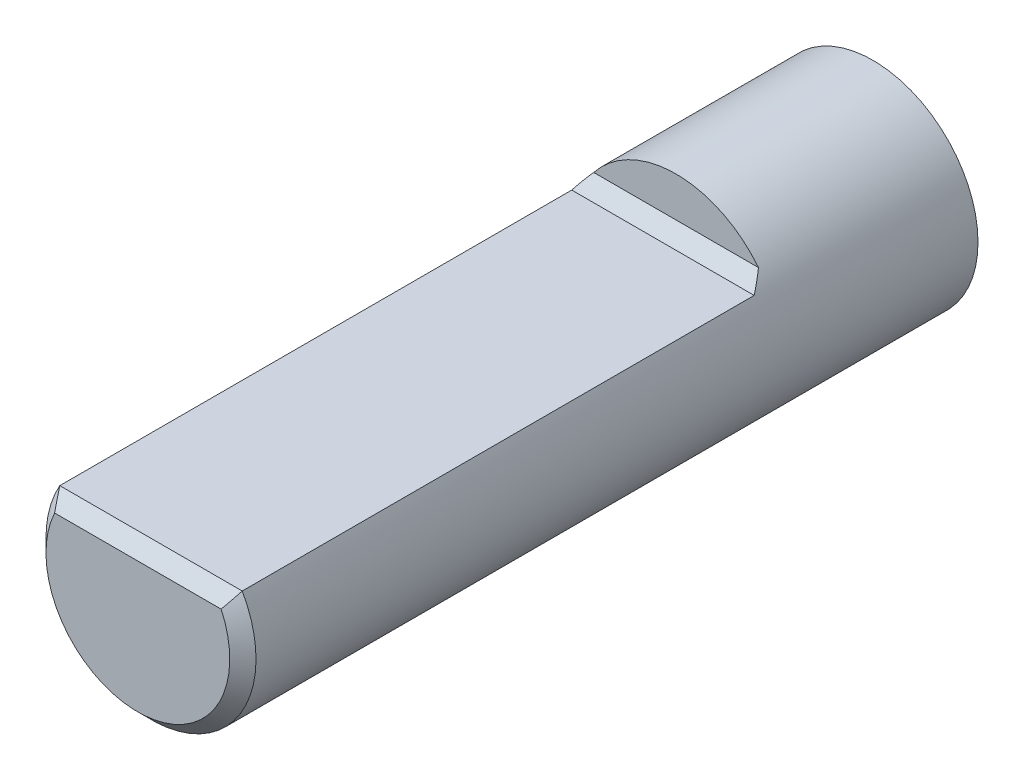
ISO-10303-21;
HEADER;
FILE_DESCRIPTION(('STEP AP214'),'2;1');
FILE_NAME('part.step','',(''),(''),'','','');
FILE_SCHEMA(('AUTOMOTIVE_DESIGN { 1 0 10303 214 1 1 1 1 }'));
ENDSEC;
DATA;
#1=APPLICATION_CONTEXT('core data for automotive mechanical design processes');
#2=APPLICATION_PROTOCOL_DEFINITION('international standard','automotive_design',2000,#1);
#3=PRODUCT_CONTEXT('',#1,'mechanical');
#4=PRODUCT('Part','Part','',(#3));
#5=PRODUCT_RELATED_PRODUCT_CATEGORY('part','',(#4));
#6=PRODUCT_DEFINITION_FORMATION('','',#4);
#7=PRODUCT_DEFINITION_CONTEXT('part definition',#1,'design');
#8=PRODUCT_DEFINITION('design','',#6,#7);
#9=PRODUCT_DEFINITION_SHAPE('','',#8);
#10=(LENGTH_UNIT() NAMED_UNIT(*) SI_UNIT(.MILLI.,.METRE.));
#11=(NAMED_UNIT(*) PLANE_ANGLE_UNIT() SI_UNIT($,.RADIAN.));
#12=(NAMED_UNIT(*) SI_UNIT($,.STERADIAN.) SOLID_ANGLE_UNIT());
#13=UNCERTAINTY_MEASURE_WITH_UNIT(LENGTH_MEASURE(1.E-05),#10,'distance_accuracy_value','');
#14=(GEOMETRIC_REPRESENTATION_CONTEXT(3) GLOBAL_UNCERTAINTY_ASSIGNED_CONTEXT((#13)) GLOBAL_UNIT_ASSIGNED_CONTEXT((#10,
#11,#12)) REPRESENTATION_CONTEXT('',''));
#15=CARTESIAN_POINT('',(0.,0.,0.));
#16=DIRECTION('',(0.,0.,1.));
#17=DIRECTION('',(1.,0.,0.));
#18=AXIS2_PLACEMENT_3D('',#15,#16,#17);
#19=CARTESIAN_POINT('',(0.,0.,28.));
#20=DIRECTION('',(0.,0.,-1.));
#21=DIRECTION('',(-1.,0.,0.));
#22=AXIS2_PLACEMENT_3D('',#19,#20,#21);
#23=CYLINDRICAL_SURFACE('',#22,4.);
#24=DIRECTION('',(0.,0.,1.));
#25=VECTOR('',#24,1.);
#26=CARTESIAN_POINT('',(3.475,1.98100353356575,7.5));
#27=LINE('',#26,#25);
#28=CARTESIAN_POINT('',(3.475,1.98100353356575,8.));
#29=VERTEX_POINT('',#28);
#30=CARTESIAN_POINT('',(3.475,1.98100353356575,27.5));
#31=VERTEX_POINT('',#30);
#32=EDGE_CURVE('E146',#29,#31,#27,.T.);
#33=ORIENTED_EDGE('',*,*,#32,.T.);
#34=CARTESIAN_POINT('',(0.,0.,27.5));
#35=DIRECTION('',(0.,0.,1.));
#36=DIRECTION('',(1.,0.,0.));
#37=AXIS2_PLACEMENT_3D('',#34,#35,#36);
#38=CIRCLE('',#37,4.);
#39=CARTESIAN_POINT('',(-3.475,1.98100353356575,27.5));
#40=VERTEX_POINT('',#39);
#41=EDGE_CURVE('E87',#31,#40,#38,.F.);
#42=ORIENTED_EDGE('',*,*,#41,.T.);
#43=DIRECTION('',(0.,0.,1.));
#44=VECTOR('',#43,1.);
#45=CARTESIAN_POINT('',(-3.475,1.98100353356575,7.5));
#46=LINE('',#45,#44);
#47=CARTESIAN_POINT('',(-3.475,1.98100353356575,8.));
#48=VERTEX_POINT('',#47);
#49=EDGE_CURVE('E145',#48,#40,#46,.T.);
#50=ORIENTED_EDGE('',*,*,#49,.F.);
#51=CARTESIAN_POINT('',(0.,0.,9.98100353356574));
#52=DIRECTION('',(0.,-0.707106781186545,-0.70710678118655));
#53=DIRECTION('',(0.,0.70710678118655,-0.707106781186545));
#54=AXIS2_PLACEMENT_3D('',#51,#52,#53);
#55=ELLIPSE('',#54,5.65685424949236,4.);
#56=CARTESIAN_POINT('',(-3.13761397664439,2.48100353356576,7.5));
#57=VERTEX_POINT('',#56);
#58=EDGE_CURVE('E11',#48,#57,#55,.T.);
#59=ORIENTED_EDGE('',*,*,#58,.T.);
#60=CARTESIAN_POINT('',(0.,0.,7.5));
#61=DIRECTION('',(0.,0.,1.));
#62=DIRECTION('',(1.,0.,0.));
#63=AXIS2_PLACEMENT_3D('',#60,#61,#62);
#64=CIRCLE('',#63,4.);
#65=CARTESIAN_POINT('',(3.13761397664439,2.48100353356576,7.5));
#66=VERTEX_POINT('',#65);
#67=EDGE_CURVE('E93',#66,#57,#64,.T.);
#68=ORIENTED_EDGE('',*,*,#67,.F.);
#69=CARTESIAN_POINT('',(0.,0.,9.98100353356574));
#70=DIRECTION('',(0.,-0.707106781186545,-0.70710678118655));
#71=DIRECTION('',(0.,0.70710678118655,-0.707106781186545));
#72=AXIS2_PLACEMENT_3D('',#69,#70,#71);
#73=ELLIPSE('',#72,5.65685424949236,4.);
#74=EDGE_CURVE('E47',#66,#29,#73,.T.);
#75=ORIENTED_EDGE('',*,*,#74,.T.);
#76=EDGE_LOOP('',(#33,#42,#50,#59,#68,#75));
#77=FACE_BOUND('',#76,.T.);
#78=CARTESIAN_POINT('',(0.,0.,0.));
#79=DIRECTION('',(0.,0.,1.));
#80=DIRECTION('',(1.,0.,0.));
#81=AXIS2_PLACEMENT_3D('',#78,#79,#80);
#82=CIRCLE('',#81,4.);
#83=CARTESIAN_POINT('',(4.,0.,0.));
#84=VERTEX_POINT('',#83);
#85=EDGE_CURVE('E141',#84,#84,#82,.T.);
#86=ORIENTED_EDGE('',*,*,#85,.T.);
#87=EDGE_LOOP('',(#86));
#88=FACE_BOUND('',#87,.T.);
#89=ADVANCED_FACE('F33',(#77,#88),#23,.T.);
#90=CARTESIAN_POINT('',(0.,0.,28.));
#91=DIRECTION('',(0.,0.,1.));
#92=DIRECTION('',(1.,0.,0.));
#93=AXIS2_PLACEMENT_3D('',#90,#91,#92);
#94=PLANE('',#93);
#95=DIRECTION('',(-1.,0.,0.));
#96=VECTOR('',#95,1.);
#97=CARTESIAN_POINT('',(-3.475,1.48100353356575,28.));
#98=LINE('',#97,#96);
#99=CARTESIAN_POINT('',(3.17121877731047,1.48100353356575,28.));
#100=VERTEX_POINT('',#99);
#101=CARTESIAN_POINT('',(-3.17121877731047,1.48100353356575,28.));
#102=VERTEX_POINT('',#101);
#103=EDGE_CURVE('E90',#100,#102,#98,.T.);
#104=ORIENTED_EDGE('',*,*,#103,.T.);
#105=CARTESIAN_POINT('',(0.,0.,28.));
#106=DIRECTION('',(0.,0.,1.));
#107=DIRECTION('',(1.,0.,0.));
#108=AXIS2_PLACEMENT_3D('',#105,#106,#107);
#109=CIRCLE('',#108,3.5);
#110=EDGE_CURVE('E85',#102,#100,#109,.T.);
#111=ORIENTED_EDGE('',*,*,#110,.T.);
#112=EDGE_LOOP('',(#104,#111));
#113=FACE_BOUND('',#112,.T.);
#114=ADVANCED_FACE('F95',(#113),#94,.T.);
#115=CARTESIAN_POINT('',(0.,0.,0.));
#116=DIRECTION('',(0.,0.,1.));
#117=DIRECTION('',(1.,0.,0.));
#118=AXIS2_PLACEMENT_3D('',#115,#116,#117);
#119=PLANE('',#118);
#120=ORIENTED_EDGE('',*,*,#85,.F.);
#121=EDGE_LOOP('',(#120));
#122=FACE_BOUND('',#121,.T.);
#123=ADVANCED_FACE('F125',(#122),#119,.F.);
#124=CARTESIAN_POINT('',(0.,0.,7.5));
#125=DIRECTION('',(0.,0.,1.));
#126=DIRECTION('',(1.,0.,0.));
#127=AXIS2_PLACEMENT_3D('',#124,#125,#126);
#128=PLANE('',#127);
#129=ORIENTED_EDGE('',*,*,#67,.T.);
#130=DIRECTION('',(1.,0.,0.));
#131=VECTOR('',#130,1.);
#132=CARTESIAN_POINT('',(0.,2.48100353356576,7.5));
#133=LINE('',#132,#131);
#134=EDGE_CURVE('E103',#57,#66,#133,.T.);
#135=ORIENTED_EDGE('',*,*,#134,.T.);
#136=EDGE_LOOP('',(#129,#135));
#137=FACE_BOUND('',#136,.T.);
#138=ADVANCED_FACE('F130',(#137),#128,.T.);
#139=CARTESIAN_POINT('',(-3.475,1.98100353356575,7.5));
#140=DIRECTION('',(0.,-1.,0.));
#141=DIRECTION('',(0.,0.,-1.));
#142=AXIS2_PLACEMENT_3D('',#139,#140,#141);
#143=PLANE('',#142);
#144=ORIENTED_EDGE('',*,*,#49,.T.);
#145=DIRECTION('',(1.,0.,0.));
#146=VECTOR('',#145,1.);
#147=CARTESIAN_POINT('',(3.475,1.98100353356575,27.5));
#148=LINE('',#147,#146);
#149=EDGE_CURVE('E55',#40,#31,#148,.T.);
#150=ORIENTED_EDGE('',*,*,#149,.T.);
#151=ORIENTED_EDGE('',*,*,#32,.F.);
#152=DIRECTION('',(-1.,0.,0.));
#153=VECTOR('',#152,1.);
#154=CARTESIAN_POINT('',(-3.475,1.98100353356575,8.));
#155=LINE('',#154,#153);
#156=EDGE_CURVE('E97',#29,#48,#155,.T.);
#157=ORIENTED_EDGE('',*,*,#156,.T.);
#158=EDGE_LOOP('',(#144,#150,#151,#157));
#159=FACE_BOUND('',#158,.T.);
#160=ADVANCED_FACE('F120',(#159),#143,.F.);
#161=CARTESIAN_POINT('',(-3.475,1.98100353356575,27.5));
#162=DIRECTION('',(0.,0.707106781186545,0.70710678118655));
#163=DIRECTION('',(-1.,0.,0.));
#164=AXIS2_PLACEMENT_3D('',#161,#162,#163);
#165=PLANE('',#164);
#166=CARTESIAN_POINT('',(3.17121877731047,1.48100353356548,28.));
#167=CARTESIAN_POINT('',(3.1975478123326,1.52235924075695,27.9586442928087));
#168=CARTESIAN_POINT('',(3.22360507243224,1.5638012195581,27.9172023140076));
#169=CARTESIAN_POINT('',(3.27520250214202,1.64684245822356,27.8341610753422));
#170=CARTESIAN_POINT('',(3.30074270714506,1.68844170708968,27.7925618264761));
#171=CARTESIAN_POINT('',(3.35133581309392,1.77178744364275,27.709216089923));
#172=CARTESIAN_POINT('',(3.37638871946756,1.81353392968355,27.6674696038822));
#173=CARTESIAN_POINT('',(3.42603401889978,1.89716699031579,27.58383654325));
#174=CARTESIAN_POINT('',(3.45062638021405,1.93905357433103,27.5419499592347));
#175=CARTESIAN_POINT('',(3.475,1.98100353356575,27.5));
#176=B_SPLINE_CURVE_WITH_KNOTS('',3,(#166,#167,#168,#169,#170,#171,#172,#173,#174,#175),
.UNSPECIFIED.,.F.,.F.,(4,2,2,2,4),(0.,0.192415762087776,0.384818308293247,0.577218710174531,
0.769632325318967),.UNSPECIFIED.);
#177=EDGE_CURVE('E81',#31,#100,#176,.F.);
#178=ORIENTED_EDGE('',*,*,#177,.F.);
#179=ORIENTED_EDGE('',*,*,#149,.F.);
#180=CARTESIAN_POINT('',(-3.475,1.98100353356575,27.5));
#181=CARTESIAN_POINT('',(-3.45062638021406,1.93905357433102,27.5419499592347));
#182=CARTESIAN_POINT('',(-3.42603401889978,1.89716699031578,27.58383654325));
#183=CARTESIAN_POINT('',(-3.37638871946755,1.81353392968355,27.6674696038822));
#184=CARTESIAN_POINT('',(-3.35133581309391,1.77178744364275,27.709216089923));
#185=CARTESIAN_POINT('',(-3.30074270714506,1.68844170708968,27.7925618264761));
#186=CARTESIAN_POINT('',(-3.27520250214203,1.64684245822354,27.8341610753422));
#187=CARTESIAN_POINT('',(-3.22360507243222,1.56380121955811,27.9172023140076));
#188=CARTESIAN_POINT('',(-3.19754781233254,1.52235924075701,27.9586442928087));
#189=CARTESIAN_POINT('',(-3.17121877731029,1.48100353356567,28.0000000000001));
#190=B_SPLINE_CURVE_WITH_KNOTS('',3,(#180,#181,#182,#183,#184,#185,#186,#187,#188,#189),
.UNSPECIFIED.,.F.,.F.,(4,2,2,2,4),(0.,0.192413615144439,0.384814017025721,0.577216563231198,
0.769632325318976),.UNSPECIFIED.);
#191=EDGE_CURVE('E37',#102,#40,#190,.F.);
#192=ORIENTED_EDGE('',*,*,#191,.F.);
#193=ORIENTED_EDGE('',*,*,#103,.F.);
#194=EDGE_LOOP('',(#178,#179,#192,#193));
#195=FACE_BOUND('',#194,.T.);
#196=ADVANCED_FACE('F91',(#195),#165,.T.);
#197=CARTESIAN_POINT('',(0.,0.,28.));
#198=DIRECTION('',(0.,0.,-1.));
#199=DIRECTION('',(-1.,0.,0.));
#200=AXIS2_PLACEMENT_3D('',#197,#198,#199);
#201=CONICAL_SURFACE('',#200,3.5,0.785398163397452);
#202=ORIENTED_EDGE('',*,*,#191,.T.);
#203=ORIENTED_EDGE('',*,*,#41,.F.);
#204=ORIENTED_EDGE('',*,*,#177,.T.);
#205=ORIENTED_EDGE('',*,*,#110,.F.);
#206=EDGE_LOOP('',(#202,#203,#204,#205));
#207=FACE_BOUND('',#206,.T.);
#208=ADVANCED_FACE('F83',(#207),#201,.T.);
#209=CARTESIAN_POINT('',(0.,2.48100353356576,7.5));
#210=DIRECTION('',(0.,-0.707106781186545,-0.70710678118655));
#211=DIRECTION('',(1.,0.,0.));
#212=AXIS2_PLACEMENT_3D('',#209,#210,#211);
#213=PLANE('',#212);
#214=ORIENTED_EDGE('',*,*,#58,.F.);
#215=ORIENTED_EDGE('',*,*,#156,.F.);
#216=ORIENTED_EDGE('',*,*,#74,.F.);
#217=ORIENTED_EDGE('',*,*,#134,.F.);
#218=EDGE_LOOP('',(#214,#215,#216,#217));
#219=FACE_BOUND('',#218,.T.);
#220=ADVANCED_FACE('F35',(#219),#213,.F.);
#221=CLOSED_SHELL('',(#89,#114,#123,#138,#160,#196,#208,#220));
#222=MANIFOLD_SOLID_BREP('B2',#221);
#223=ADVANCED_BREP_SHAPE_REPRESENTATION('',(#18,#222),#14);
#224=SHAPE_DEFINITION_REPRESENTATION(#9,#223);
ENDSEC;
END-ISO-10303-21;
